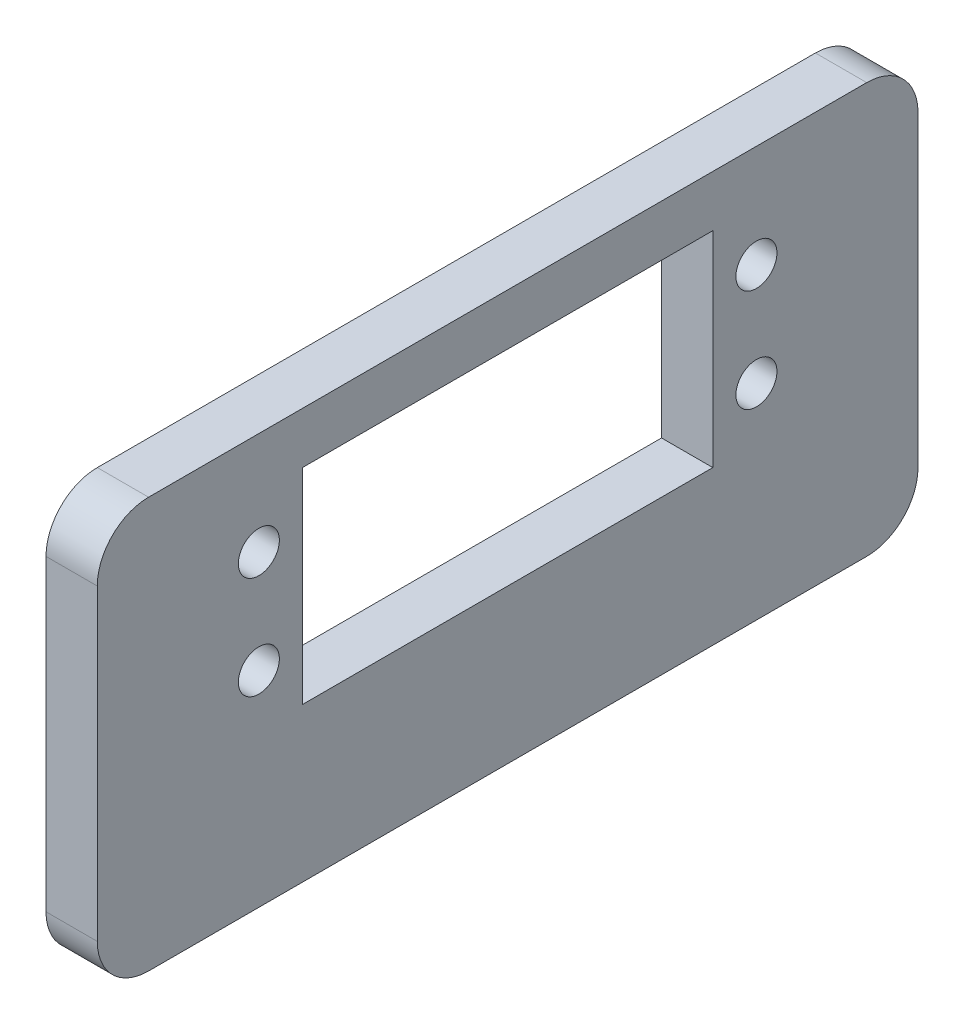
ISO-10303-21;
HEADER;
FILE_DESCRIPTION(('STEP AP214'),'2;1');
FILE_NAME('part.step','',(''),(''),'','','');
FILE_SCHEMA(('AUTOMOTIVE_DESIGN { 1 0 10303 214 1 1 1 1 }'));
ENDSEC;
DATA;
#1=APPLICATION_CONTEXT('core data for automotive mechanical design processes');
#2=APPLICATION_PROTOCOL_DEFINITION('international standard','automotive_design',2000,#1);
#3=PRODUCT_CONTEXT('',#1,'mechanical');
#4=PRODUCT('Part','Part','',(#3));
#5=PRODUCT_RELATED_PRODUCT_CATEGORY('part','',(#4));
#6=PRODUCT_DEFINITION_FORMATION('','',#4);
#7=PRODUCT_DEFINITION_CONTEXT('part definition',#1,'design');
#8=PRODUCT_DEFINITION('design','',#6,#7);
#9=PRODUCT_DEFINITION_SHAPE('','',#8);
#10=(LENGTH_UNIT() NAMED_UNIT(*) SI_UNIT(.MILLI.,.METRE.));
#11=(NAMED_UNIT(*) PLANE_ANGLE_UNIT() SI_UNIT($,.RADIAN.));
#12=(NAMED_UNIT(*) SI_UNIT($,.STERADIAN.) SOLID_ANGLE_UNIT());
#13=UNCERTAINTY_MEASURE_WITH_UNIT(LENGTH_MEASURE(1.E-05),#10,'distance_accuracy_value','');
#14=(GEOMETRIC_REPRESENTATION_CONTEXT(3) GLOBAL_UNCERTAINTY_ASSIGNED_CONTEXT((#13)) GLOBAL_UNIT_ASSIGNED_CONTEXT((#10,
#11,#12)) REPRESENTATION_CONTEXT('',''));
#15=CARTESIAN_POINT('',(0.,0.,0.));
#16=DIRECTION('',(0.,0.,1.));
#17=DIRECTION('',(1.,0.,0.));
#18=AXIS2_PLACEMENT_3D('',#15,#16,#17);
#19=CARTESIAN_POINT('',(5.,0.,0.));
#20=DIRECTION('',(1.,0.,0.));
#21=DIRECTION('',(0.,0.,-1.));
#22=AXIS2_PLACEMENT_3D('',#19,#20,#21);
#23=PLANE('',#22);
#24=CARTESIAN_POINT('',(5.,9.99999999999998,24.25));
#25=DIRECTION('',(1.,0.,0.));
#26=DIRECTION('',(0.,0.,1.));
#27=AXIS2_PLACEMENT_3D('',#24,#25,#26);
#28=CIRCLE('',#27,2.00000000000001);
#29=CARTESIAN_POINT('',(5.,9.99999999999998,26.25));
#30=VERTEX_POINT('',#29);
#31=EDGE_CURVE('E177',#30,#30,#28,.T.);
#32=ORIENTED_EDGE('',*,*,#31,.F.);
#33=EDGE_LOOP('',(#32));
#34=FACE_BOUND('',#33,.T.);
#35=CARTESIAN_POINT('',(5.,9.99999999999999,-24.25));
#36=DIRECTION('',(1.,0.,0.));
#37=DIRECTION('',(0.,0.,-1.));
#38=AXIS2_PLACEMENT_3D('',#35,#36,#37);
#39=CIRCLE('',#38,2.);
#40=CARTESIAN_POINT('',(5.,9.99999999999999,-26.25));
#41=VERTEX_POINT('',#40);
#42=EDGE_CURVE('E189',#41,#41,#39,.T.);
#43=ORIENTED_EDGE('',*,*,#42,.F.);
#44=EDGE_LOOP('',(#43));
#45=FACE_BOUND('',#44,.T.);
#46=DIRECTION('',(0.,-1.,0.));
#47=VECTOR('',#46,1.);
#48=CARTESIAN_POINT('',(5.,-20.,40.));
#49=LINE('',#48,#47);
#50=CARTESIAN_POINT('',(5.,15.,40.));
#51=VERTEX_POINT('',#50);
#52=CARTESIAN_POINT('',(5.,-15.,40.));
#53=VERTEX_POINT('',#52);
#54=EDGE_CURVE('E195',#51,#53,#49,.T.);
#55=ORIENTED_EDGE('',*,*,#54,.T.);
#56=CARTESIAN_POINT('',(5.,-15.,35.));
#57=DIRECTION('',(1.,0.,0.));
#58=DIRECTION('',(0.,0.,-1.));
#59=AXIS2_PLACEMENT_3D('',#56,#57,#58);
#60=CIRCLE('',#59,5.);
#61=CARTESIAN_POINT('',(5.,-20.,35.));
#62=VERTEX_POINT('',#61);
#63=EDGE_CURVE('E238',#53,#62,#60,.T.);
#64=ORIENTED_EDGE('',*,*,#63,.T.);
#65=DIRECTION('',(0.,0.,-1.));
#66=VECTOR('',#65,1.);
#67=CARTESIAN_POINT('',(5.,-20.,-40.));
#68=LINE('',#67,#66);
#69=CARTESIAN_POINT('',(5.,-20.,-35.));
#70=VERTEX_POINT('',#69);
#71=EDGE_CURVE('E198',#62,#70,#68,.T.);
#72=ORIENTED_EDGE('',*,*,#71,.T.);
#73=CARTESIAN_POINT('',(5.,-15.,-35.));
#74=DIRECTION('',(1.,0.,0.));
#75=DIRECTION('',(0.,0.,-1.));
#76=AXIS2_PLACEMENT_3D('',#73,#74,#75);
#77=CIRCLE('',#76,5.);
#78=CARTESIAN_POINT('',(5.,-15.,-40.));
#79=VERTEX_POINT('',#78);
#80=EDGE_CURVE('E236',#70,#79,#77,.T.);
#81=ORIENTED_EDGE('',*,*,#80,.T.);
#82=DIRECTION('',(0.,1.,0.));
#83=VECTOR('',#82,1.);
#84=CARTESIAN_POINT('',(5.,-20.,-40.));
#85=LINE('',#84,#83);
#86=CARTESIAN_POINT('',(5.,15.,-40.));
#87=VERTEX_POINT('',#86);
#88=EDGE_CURVE('E202',#79,#87,#85,.T.);
#89=ORIENTED_EDGE('',*,*,#88,.T.);
#90=CARTESIAN_POINT('',(5.,15.,-35.));
#91=DIRECTION('',(1.,0.,0.));
#92=DIRECTION('',(0.,0.,-1.));
#93=AXIS2_PLACEMENT_3D('',#90,#91,#92);
#94=CIRCLE('',#93,5.);
#95=CARTESIAN_POINT('',(5.,20.,-35.));
#96=VERTEX_POINT('',#95);
#97=EDGE_CURVE('E60',#87,#96,#94,.T.);
#98=ORIENTED_EDGE('',*,*,#97,.T.);
#99=DIRECTION('',(0.,0.,1.));
#100=VECTOR('',#99,1.);
#101=CARTESIAN_POINT('',(5.,20.,-40.));
#102=LINE('',#101,#100);
#103=CARTESIAN_POINT('',(5.,20.,35.));
#104=VERTEX_POINT('',#103);
#105=EDGE_CURVE('E204',#96,#104,#102,.T.);
#106=ORIENTED_EDGE('',*,*,#105,.T.);
#107=CARTESIAN_POINT('',(5.,15.,35.));
#108=DIRECTION('',(1.,0.,0.));
#109=DIRECTION('',(0.,0.,-1.));
#110=AXIS2_PLACEMENT_3D('',#107,#108,#109);
#111=CIRCLE('',#110,5.);
#112=EDGE_CURVE('E233',#104,#51,#111,.T.);
#113=ORIENTED_EDGE('',*,*,#112,.T.);
#114=EDGE_LOOP('',(#55,#64,#72,#81,#89,#98,#106,#113));
#115=FACE_BOUND('',#114,.T.);
#116=CARTESIAN_POINT('',(5.,0.,-24.25));
#117=DIRECTION('',(1.,0.,0.));
#118=DIRECTION('',(0.,0.,-1.));
#119=AXIS2_PLACEMENT_3D('',#116,#117,#118);
#120=CIRCLE('',#119,2.);
#121=CARTESIAN_POINT('',(5.,0.,-26.25));
#122=VERTEX_POINT('',#121);
#123=EDGE_CURVE('E183',#122,#122,#120,.T.);
#124=ORIENTED_EDGE('',*,*,#123,.F.);
#125=EDGE_LOOP('',(#124));
#126=FACE_BOUND('',#125,.T.);
#127=CARTESIAN_POINT('',(5.,0.,24.25));
#128=DIRECTION('',(1.,0.,0.));
#129=DIRECTION('',(0.,0.,1.));
#130=AXIS2_PLACEMENT_3D('',#127,#128,#129);
#131=CIRCLE('',#130,2.);
#132=CARTESIAN_POINT('',(5.,0.,26.25));
#133=VERTEX_POINT('',#132);
#134=EDGE_CURVE('E171',#133,#133,#131,.T.);
#135=ORIENTED_EDGE('',*,*,#134,.F.);
#136=EDGE_LOOP('',(#135));
#137=FACE_BOUND('',#136,.T.);
#138=DIRECTION('',(0.,0.,-1.));
#139=VECTOR('',#138,1.);
#140=CARTESIAN_POINT('',(5.,-5.00000000000002,-20.));
#141=LINE('',#140,#139);
#142=CARTESIAN_POINT('',(5.,-5.00000000000002,20.));
#143=VERTEX_POINT('',#142);
#144=CARTESIAN_POINT('',(5.,-5.00000000000002,-20.));
#145=VERTEX_POINT('',#144);
#146=EDGE_CURVE('E140',#143,#145,#141,.T.);
#147=ORIENTED_EDGE('',*,*,#146,.F.);
#148=DIRECTION('',(0.,-1.,0.));
#149=VECTOR('',#148,1.);
#150=CARTESIAN_POINT('',(5.,-5.00000000000002,20.));
#151=LINE('',#150,#149);
#152=CARTESIAN_POINT('',(5.,15.,20.));
#153=VERTEX_POINT('',#152);
#154=EDGE_CURVE('E130',#153,#143,#151,.T.);
#155=ORIENTED_EDGE('',*,*,#154,.F.);
#156=DIRECTION('',(0.,0.,1.));
#157=VECTOR('',#156,1.);
#158=CARTESIAN_POINT('',(5.,15.,-20.));
#159=LINE('',#158,#157);
#160=CARTESIAN_POINT('',(5.,15.,-20.));
#161=VERTEX_POINT('',#160);
#162=EDGE_CURVE('E155',#161,#153,#159,.T.);
#163=ORIENTED_EDGE('',*,*,#162,.F.);
#164=DIRECTION('',(0.,1.,0.));
#165=VECTOR('',#164,1.);
#166=CARTESIAN_POINT('',(5.,-5.00000000000002,-20.));
#167=LINE('',#166,#165);
#168=EDGE_CURVE('E153',#145,#161,#167,.T.);
#169=ORIENTED_EDGE('',*,*,#168,.F.);
#170=EDGE_LOOP('',(#147,#155,#163,#169));
#171=FACE_BOUND('',#170,.T.);
#172=ADVANCED_FACE('F39',(#34,#45,#115,#126,#137,#171),#23,.T.);
#173=CARTESIAN_POINT('',(0.,0.,0.));
#174=DIRECTION('',(1.,0.,0.));
#175=DIRECTION('',(0.,0.,-1.));
#176=AXIS2_PLACEMENT_3D('',#173,#174,#175);
#177=PLANE('',#176);
#178=CARTESIAN_POINT('',(0.,0.,24.25));
#179=DIRECTION('',(1.,0.,0.));
#180=DIRECTION('',(0.,0.,1.));
#181=AXIS2_PLACEMENT_3D('',#178,#179,#180);
#182=CIRCLE('',#181,2.);
#183=CARTESIAN_POINT('',(0.,0.,26.25));
#184=VERTEX_POINT('',#183);
#185=EDGE_CURVE('E148',#184,#184,#182,.T.);
#186=ORIENTED_EDGE('',*,*,#185,.T.);
#187=EDGE_LOOP('',(#186));
#188=FACE_BOUND('',#187,.T.);
#189=CARTESIAN_POINT('',(0.,9.99999999999998,24.25));
#190=DIRECTION('',(1.,0.,0.));
#191=DIRECTION('',(0.,0.,1.));
#192=AXIS2_PLACEMENT_3D('',#189,#190,#191);
#193=CIRCLE('',#192,2.00000000000001);
#194=CARTESIAN_POINT('',(0.,9.99999999999998,26.25));
#195=VERTEX_POINT('',#194);
#196=EDGE_CURVE('E174',#195,#195,#193,.T.);
#197=ORIENTED_EDGE('',*,*,#196,.T.);
#198=EDGE_LOOP('',(#197));
#199=FACE_BOUND('',#198,.T.);
#200=CARTESIAN_POINT('',(0.,0.,-24.25));
#201=DIRECTION('',(1.,0.,0.));
#202=DIRECTION('',(0.,0.,-1.));
#203=AXIS2_PLACEMENT_3D('',#200,#201,#202);
#204=CIRCLE('',#203,2.);
#205=CARTESIAN_POINT('',(0.,0.,-26.25));
#206=VERTEX_POINT('',#205);
#207=EDGE_CURVE('E180',#206,#206,#204,.T.);
#208=ORIENTED_EDGE('',*,*,#207,.T.);
#209=EDGE_LOOP('',(#208));
#210=FACE_BOUND('',#209,.T.);
#211=CARTESIAN_POINT('',(0.,9.99999999999999,-24.25));
#212=DIRECTION('',(1.,0.,0.));
#213=DIRECTION('',(0.,0.,-1.));
#214=AXIS2_PLACEMENT_3D('',#211,#212,#213);
#215=CIRCLE('',#214,2.);
#216=CARTESIAN_POINT('',(0.,9.99999999999999,-26.25));
#217=VERTEX_POINT('',#216);
#218=EDGE_CURVE('E186',#217,#217,#215,.T.);
#219=ORIENTED_EDGE('',*,*,#218,.T.);
#220=EDGE_LOOP('',(#219));
#221=FACE_BOUND('',#220,.T.);
#222=DIRECTION('',(0.,0.,-1.));
#223=VECTOR('',#222,1.);
#224=CARTESIAN_POINT('',(0.,-20.,-40.));
#225=LINE('',#224,#223);
#226=CARTESIAN_POINT('',(0.,-20.,35.));
#227=VERTEX_POINT('',#226);
#228=CARTESIAN_POINT('',(0.,-20.,-35.));
#229=VERTEX_POINT('',#228);
#230=EDGE_CURVE('E209',#227,#229,#225,.T.);
#231=ORIENTED_EDGE('',*,*,#230,.F.);
#232=CARTESIAN_POINT('',(0.,-15.,35.));
#233=DIRECTION('',(1.,0.,0.));
#234=DIRECTION('',(0.,0.,-1.));
#235=AXIS2_PLACEMENT_3D('',#232,#233,#234);
#236=CIRCLE('',#235,5.);
#237=CARTESIAN_POINT('',(0.,-15.,40.));
#238=VERTEX_POINT('',#237);
#239=EDGE_CURVE('E226',#227,#238,#236,.F.);
#240=ORIENTED_EDGE('',*,*,#239,.T.);
#241=DIRECTION('',(0.,-1.,0.));
#242=VECTOR('',#241,1.);
#243=CARTESIAN_POINT('',(0.,-20.,40.));
#244=LINE('',#243,#242);
#245=CARTESIAN_POINT('',(0.,15.,40.));
#246=VERTEX_POINT('',#245);
#247=EDGE_CURVE('E192',#246,#238,#244,.T.);
#248=ORIENTED_EDGE('',*,*,#247,.F.);
#249=CARTESIAN_POINT('',(0.,15.,35.));
#250=DIRECTION('',(1.,0.,0.));
#251=DIRECTION('',(0.,0.,-1.));
#252=AXIS2_PLACEMENT_3D('',#249,#250,#251);
#253=CIRCLE('',#252,5.);
#254=CARTESIAN_POINT('',(0.,20.,35.));
#255=VERTEX_POINT('',#254);
#256=EDGE_CURVE('E220',#246,#255,#253,.F.);
#257=ORIENTED_EDGE('',*,*,#256,.T.);
#258=DIRECTION('',(0.,0.,1.));
#259=VECTOR('',#258,1.);
#260=CARTESIAN_POINT('',(0.,20.,-40.));
#261=LINE('',#260,#259);
#262=CARTESIAN_POINT('',(0.,20.,-35.));
#263=VERTEX_POINT('',#262);
#264=EDGE_CURVE('E199',#263,#255,#261,.T.);
#265=ORIENTED_EDGE('',*,*,#264,.F.);
#266=CARTESIAN_POINT('',(0.,15.,-35.));
#267=DIRECTION('',(1.,0.,0.));
#268=DIRECTION('',(0.,0.,-1.));
#269=AXIS2_PLACEMENT_3D('',#266,#267,#268);
#270=CIRCLE('',#269,5.);
#271=CARTESIAN_POINT('',(0.,15.,-40.));
#272=VERTEX_POINT('',#271);
#273=EDGE_CURVE('E222',#263,#272,#270,.F.);
#274=ORIENTED_EDGE('',*,*,#273,.T.);
#275=DIRECTION('',(0.,1.,0.));
#276=VECTOR('',#275,1.);
#277=CARTESIAN_POINT('',(0.,-20.,-40.));
#278=LINE('',#277,#276);
#279=CARTESIAN_POINT('',(0.,-15.,-40.));
#280=VERTEX_POINT('',#279);
#281=EDGE_CURVE('E212',#280,#272,#278,.T.);
#282=ORIENTED_EDGE('',*,*,#281,.F.);
#283=CARTESIAN_POINT('',(0.,-15.,-35.));
#284=DIRECTION('',(1.,0.,0.));
#285=DIRECTION('',(0.,0.,-1.));
#286=AXIS2_PLACEMENT_3D('',#283,#284,#285);
#287=CIRCLE('',#286,5.);
#288=EDGE_CURVE('E224',#280,#229,#287,.F.);
#289=ORIENTED_EDGE('',*,*,#288,.T.);
#290=EDGE_LOOP('',(#231,#240,#248,#257,#265,#274,#282,#289));
#291=FACE_BOUND('',#290,.T.);
#292=DIRECTION('',(0.,-1.,0.));
#293=VECTOR('',#292,1.);
#294=CARTESIAN_POINT('',(0.,-5.00000000000002,20.));
#295=LINE('',#294,#293);
#296=CARTESIAN_POINT('',(0.,15.,20.));
#297=VERTEX_POINT('',#296);
#298=CARTESIAN_POINT('',(0.,-5.00000000000002,20.));
#299=VERTEX_POINT('',#298);
#300=EDGE_CURVE('E159',#297,#299,#295,.T.);
#301=ORIENTED_EDGE('',*,*,#300,.T.);
#302=DIRECTION('',(0.,0.,-1.));
#303=VECTOR('',#302,1.);
#304=CARTESIAN_POINT('',(0.,-5.00000000000002,-20.));
#305=LINE('',#304,#303);
#306=CARTESIAN_POINT('',(0.,-5.00000000000002,-20.));
#307=VERTEX_POINT('',#306);
#308=EDGE_CURVE('E147',#299,#307,#305,.T.);
#309=ORIENTED_EDGE('',*,*,#308,.T.);
#310=DIRECTION('',(0.,1.,0.));
#311=VECTOR('',#310,1.);
#312=CARTESIAN_POINT('',(0.,-5.00000000000002,-20.));
#313=LINE('',#312,#311);
#314=CARTESIAN_POINT('',(0.,15.,-20.));
#315=VERTEX_POINT('',#314);
#316=EDGE_CURVE('E162',#307,#315,#313,.T.);
#317=ORIENTED_EDGE('',*,*,#316,.T.);
#318=DIRECTION('',(0.,0.,1.));
#319=VECTOR('',#318,1.);
#320=CARTESIAN_POINT('',(0.,15.,-20.));
#321=LINE('',#320,#319);
#322=EDGE_CURVE('E141',#315,#297,#321,.T.);
#323=ORIENTED_EDGE('',*,*,#322,.T.);
#324=EDGE_LOOP('',(#301,#309,#317,#323));
#325=FACE_BOUND('',#324,.T.);
#326=ADVANCED_FACE('F254',(#188,#199,#210,#221,#291,#325),#177,.F.);
#327=CARTESIAN_POINT('',(5.,-20.,40.));
#328=DIRECTION('',(0.,0.,-1.));
#329=DIRECTION('',(0.,1.,0.));
#330=AXIS2_PLACEMENT_3D('',#327,#328,#329);
#331=PLANE('',#330);
#332=ORIENTED_EDGE('',*,*,#247,.T.);
#333=DIRECTION('',(-1.,0.,0.));
#334=VECTOR('',#333,1.);
#335=CARTESIAN_POINT('',(5.,-15.,40.));
#336=LINE('',#335,#334);
#337=EDGE_CURVE('E231',#238,#53,#336,.F.);
#338=ORIENTED_EDGE('',*,*,#337,.T.);
#339=ORIENTED_EDGE('',*,*,#54,.F.);
#340=DIRECTION('',(-1.,0.,0.));
#341=VECTOR('',#340,1.);
#342=CARTESIAN_POINT('',(5.,15.,40.));
#343=LINE('',#342,#341);
#344=EDGE_CURVE('E228',#51,#246,#343,.T.);
#345=ORIENTED_EDGE('',*,*,#344,.T.);
#346=EDGE_LOOP('',(#332,#338,#339,#345));
#347=FACE_BOUND('',#346,.T.);
#348=ADVANCED_FACE('F268',(#347),#331,.F.);
#349=CARTESIAN_POINT('',(5.,-20.,-40.));
#350=DIRECTION('',(0.,1.,0.));
#351=DIRECTION('',(0.,0.,1.));
#352=AXIS2_PLACEMENT_3D('',#349,#350,#351);
#353=PLANE('',#352);
#354=ORIENTED_EDGE('',*,*,#71,.F.);
#355=DIRECTION('',(-1.,0.,0.));
#356=VECTOR('',#355,1.);
#357=CARTESIAN_POINT('',(5.,-20.,35.));
#358=LINE('',#357,#356);
#359=EDGE_CURVE('E217',#62,#227,#358,.T.);
#360=ORIENTED_EDGE('',*,*,#359,.T.);
#361=ORIENTED_EDGE('',*,*,#230,.T.);
#362=DIRECTION('',(-1.,0.,0.));
#363=VECTOR('',#362,1.);
#364=CARTESIAN_POINT('',(5.,-20.,-35.));
#365=LINE('',#364,#363);
#366=EDGE_CURVE('E206',#229,#70,#365,.F.);
#367=ORIENTED_EDGE('',*,*,#366,.T.);
#368=EDGE_LOOP('',(#354,#360,#361,#367));
#369=FACE_BOUND('',#368,.T.);
#370=ADVANCED_FACE('F276',(#369),#353,.F.);
#371=CARTESIAN_POINT('',(5.,-20.,-40.));
#372=DIRECTION('',(0.,0.,1.));
#373=DIRECTION('',(0.,-1.,0.));
#374=AXIS2_PLACEMENT_3D('',#371,#372,#373);
#375=PLANE('',#374);
#376=ORIENTED_EDGE('',*,*,#88,.F.);
#377=DIRECTION('',(-1.,0.,0.));
#378=VECTOR('',#377,1.);
#379=CARTESIAN_POINT('',(5.,-15.,-40.));
#380=LINE('',#379,#378);
#381=EDGE_CURVE('E242',#79,#280,#380,.T.);
#382=ORIENTED_EDGE('',*,*,#381,.T.);
#383=ORIENTED_EDGE('',*,*,#281,.T.);
#384=DIRECTION('',(-1.,0.,0.));
#385=VECTOR('',#384,1.);
#386=CARTESIAN_POINT('',(5.,15.,-40.));
#387=LINE('',#386,#385);
#388=EDGE_CURVE('E240',#272,#87,#387,.F.);
#389=ORIENTED_EDGE('',*,*,#388,.T.);
#390=EDGE_LOOP('',(#376,#382,#383,#389));
#391=FACE_BOUND('',#390,.T.);
#392=ADVANCED_FACE('F248',(#391),#375,.F.);
#393=CARTESIAN_POINT('',(5.,20.,-40.));
#394=DIRECTION('',(0.,-1.,0.));
#395=DIRECTION('',(0.,0.,-1.));
#396=AXIS2_PLACEMENT_3D('',#393,#394,#395);
#397=PLANE('',#396);
#398=ORIENTED_EDGE('',*,*,#105,.F.);
#399=DIRECTION('',(-1.,0.,0.));
#400=VECTOR('',#399,1.);
#401=CARTESIAN_POINT('',(5.,20.,-35.));
#402=LINE('',#401,#400);
#403=EDGE_CURVE('E11',#96,#263,#402,.T.);
#404=ORIENTED_EDGE('',*,*,#403,.T.);
#405=ORIENTED_EDGE('',*,*,#264,.T.);
#406=DIRECTION('',(-1.,0.,0.));
#407=VECTOR('',#406,1.);
#408=CARTESIAN_POINT('',(5.,20.,35.));
#409=LINE('',#408,#407);
#410=EDGE_CURVE('E47',#255,#104,#409,.F.);
#411=ORIENTED_EDGE('',*,*,#410,.T.);
#412=EDGE_LOOP('',(#398,#404,#405,#411));
#413=FACE_BOUND('',#412,.T.);
#414=ADVANCED_FACE('F260',(#413),#397,.F.);
#415=CARTESIAN_POINT('',(5.,9.99999999999999,-24.25));
#416=DIRECTION('',(-1.,0.,0.));
#417=DIRECTION('',(0.,0.,1.));
#418=AXIS2_PLACEMENT_3D('',#415,#416,#417);
#419=CYLINDRICAL_SURFACE('',#418,2.);
#420=ORIENTED_EDGE('',*,*,#42,.T.);
#421=EDGE_LOOP('',(#420));
#422=FACE_BOUND('',#421,.T.);
#423=ORIENTED_EDGE('',*,*,#218,.F.);
#424=EDGE_LOOP('',(#423));
#425=FACE_BOUND('',#424,.T.);
#426=ADVANCED_FACE('F299',(#422,#425),#419,.F.);
#427=CARTESIAN_POINT('',(5.,0.,-24.25));
#428=DIRECTION('',(-1.,0.,0.));
#429=DIRECTION('',(0.,0.,1.));
#430=AXIS2_PLACEMENT_3D('',#427,#428,#429);
#431=CYLINDRICAL_SURFACE('',#430,2.);
#432=ORIENTED_EDGE('',*,*,#123,.T.);
#433=EDGE_LOOP('',(#432));
#434=FACE_BOUND('',#433,.T.);
#435=ORIENTED_EDGE('',*,*,#207,.F.);
#436=EDGE_LOOP('',(#435));
#437=FACE_BOUND('',#436,.T.);
#438=ADVANCED_FACE('F406',(#434,#437),#431,.F.);
#439=CARTESIAN_POINT('',(5.,9.99999999999998,24.25));
#440=DIRECTION('',(-1.,0.,0.));
#441=DIRECTION('',(0.,0.,1.));
#442=AXIS2_PLACEMENT_3D('',#439,#440,#441);
#443=CYLINDRICAL_SURFACE('',#442,2.00000000000001);
#444=ORIENTED_EDGE('',*,*,#31,.T.);
#445=EDGE_LOOP('',(#444));
#446=FACE_BOUND('',#445,.T.);
#447=ORIENTED_EDGE('',*,*,#196,.F.);
#448=EDGE_LOOP('',(#447));
#449=FACE_BOUND('',#448,.T.);
#450=ADVANCED_FACE('F396',(#446,#449),#443,.F.);
#451=CARTESIAN_POINT('',(5.,0.,24.25));
#452=DIRECTION('',(-1.,0.,0.));
#453=DIRECTION('',(0.,0.,1.));
#454=AXIS2_PLACEMENT_3D('',#451,#452,#453);
#455=CYLINDRICAL_SURFACE('',#454,2.);
#456=ORIENTED_EDGE('',*,*,#134,.T.);
#457=EDGE_LOOP('',(#456));
#458=FACE_BOUND('',#457,.T.);
#459=ORIENTED_EDGE('',*,*,#185,.F.);
#460=EDGE_LOOP('',(#459));
#461=FACE_BOUND('',#460,.T.);
#462=ADVANCED_FACE('F387',(#458,#461),#455,.F.);
#463=CARTESIAN_POINT('',(5.,-5.00000000000002,20.));
#464=DIRECTION('',(0.,0.,-1.));
#465=DIRECTION('',(-1.,0.,0.));
#466=AXIS2_PLACEMENT_3D('',#463,#464,#465);
#467=PLANE('',#466);
#468=ORIENTED_EDGE('',*,*,#300,.F.);
#469=DIRECTION('',(-1.,0.,0.));
#470=VECTOR('',#469,1.);
#471=CARTESIAN_POINT('',(5.,15.,20.));
#472=LINE('',#471,#470);
#473=EDGE_CURVE('E136',#153,#297,#472,.T.);
#474=ORIENTED_EDGE('',*,*,#473,.F.);
#475=ORIENTED_EDGE('',*,*,#154,.T.);
#476=DIRECTION('',(-1.,0.,0.));
#477=VECTOR('',#476,1.);
#478=CARTESIAN_POINT('',(5.,-5.00000000000002,20.));
#479=LINE('',#478,#477);
#480=EDGE_CURVE('E133',#143,#299,#479,.T.);
#481=ORIENTED_EDGE('',*,*,#480,.T.);
#482=EDGE_LOOP('',(#468,#474,#475,#481));
#483=FACE_BOUND('',#482,.T.);
#484=ADVANCED_FACE('F132',(#483),#467,.T.);
#485=CARTESIAN_POINT('',(5.,-5.00000000000002,-20.));
#486=DIRECTION('',(0.,1.,0.));
#487=DIRECTION('',(0.,0.,1.));
#488=AXIS2_PLACEMENT_3D('',#485,#486,#487);
#489=PLANE('',#488);
#490=ORIENTED_EDGE('',*,*,#308,.F.);
#491=ORIENTED_EDGE('',*,*,#480,.F.);
#492=ORIENTED_EDGE('',*,*,#146,.T.);
#493=DIRECTION('',(-1.,0.,0.));
#494=VECTOR('',#493,1.);
#495=CARTESIAN_POINT('',(5.,-5.00000000000002,-20.));
#496=LINE('',#495,#494);
#497=EDGE_CURVE('E149',#145,#307,#496,.T.);
#498=ORIENTED_EDGE('',*,*,#497,.T.);
#499=EDGE_LOOP('',(#490,#491,#492,#498));
#500=FACE_BOUND('',#499,.T.);
#501=ADVANCED_FACE('F144',(#500),#489,.T.);
#502=CARTESIAN_POINT('',(5.,-5.00000000000002,-20.));
#503=DIRECTION('',(0.,0.,1.));
#504=DIRECTION('',(1.,0.,0.));
#505=AXIS2_PLACEMENT_3D('',#502,#503,#504);
#506=PLANE('',#505);
#507=ORIENTED_EDGE('',*,*,#316,.F.);
#508=ORIENTED_EDGE('',*,*,#497,.F.);
#509=ORIENTED_EDGE('',*,*,#168,.T.);
#510=DIRECTION('',(-1.,0.,0.));
#511=VECTOR('',#510,1.);
#512=CARTESIAN_POINT('',(5.,15.,-20.));
#513=LINE('',#512,#511);
#514=EDGE_CURVE('E168',#161,#315,#513,.T.);
#515=ORIENTED_EDGE('',*,*,#514,.T.);
#516=EDGE_LOOP('',(#507,#508,#509,#515));
#517=FACE_BOUND('',#516,.T.);
#518=ADVANCED_FACE('F360',(#517),#506,.T.);
#519=CARTESIAN_POINT('',(5.,15.,-20.));
#520=DIRECTION('',(0.,-1.,0.));
#521=DIRECTION('',(0.,0.,-1.));
#522=AXIS2_PLACEMENT_3D('',#519,#520,#521);
#523=PLANE('',#522);
#524=ORIENTED_EDGE('',*,*,#322,.F.);
#525=ORIENTED_EDGE('',*,*,#514,.F.);
#526=ORIENTED_EDGE('',*,*,#162,.T.);
#527=ORIENTED_EDGE('',*,*,#473,.T.);
#528=EDGE_LOOP('',(#524,#525,#526,#527));
#529=FACE_BOUND('',#528,.T.);
#530=ADVANCED_FACE('F285',(#529),#523,.T.);
#531=CARTESIAN_POINT('',(5.,-15.,35.));
#532=DIRECTION('',(-1.,0.,0.));
#533=DIRECTION('',(0.,0.,1.));
#534=AXIS2_PLACEMENT_3D('',#531,#532,#533);
#535=CYLINDRICAL_SURFACE('',#534,5.);
#536=ORIENTED_EDGE('',*,*,#63,.F.);
#537=ORIENTED_EDGE('',*,*,#337,.F.);
#538=ORIENTED_EDGE('',*,*,#239,.F.);
#539=ORIENTED_EDGE('',*,*,#359,.F.);
#540=EDGE_LOOP('',(#536,#537,#538,#539));
#541=FACE_BOUND('',#540,.T.);
#542=ADVANCED_FACE('F273',(#541),#535,.T.);
#543=CARTESIAN_POINT('',(5.,-15.,-35.));
#544=DIRECTION('',(-1.,0.,0.));
#545=DIRECTION('',(0.,0.,1.));
#546=AXIS2_PLACEMENT_3D('',#543,#544,#545);
#547=CYLINDRICAL_SURFACE('',#546,5.);
#548=ORIENTED_EDGE('',*,*,#80,.F.);
#549=ORIENTED_EDGE('',*,*,#366,.F.);
#550=ORIENTED_EDGE('',*,*,#288,.F.);
#551=ORIENTED_EDGE('',*,*,#381,.F.);
#552=EDGE_LOOP('',(#548,#549,#550,#551));
#553=FACE_BOUND('',#552,.T.);
#554=ADVANCED_FACE('F278',(#553),#547,.T.);
#555=CARTESIAN_POINT('',(5.,15.,-35.));
#556=DIRECTION('',(-1.,0.,0.));
#557=DIRECTION('',(0.,0.,1.));
#558=AXIS2_PLACEMENT_3D('',#555,#556,#557);
#559=CYLINDRICAL_SURFACE('',#558,5.);
#560=ORIENTED_EDGE('',*,*,#97,.F.);
#561=ORIENTED_EDGE('',*,*,#388,.F.);
#562=ORIENTED_EDGE('',*,*,#273,.F.);
#563=ORIENTED_EDGE('',*,*,#403,.F.);
#564=EDGE_LOOP('',(#560,#561,#562,#563));
#565=FACE_BOUND('',#564,.T.);
#566=ADVANCED_FACE('F259',(#565),#559,.T.);
#567=CARTESIAN_POINT('',(5.,15.,35.));
#568=DIRECTION('',(-1.,0.,0.));
#569=DIRECTION('',(0.,0.,1.));
#570=AXIS2_PLACEMENT_3D('',#567,#568,#569);
#571=CYLINDRICAL_SURFACE('',#570,5.);
#572=ORIENTED_EDGE('',*,*,#112,.F.);
#573=ORIENTED_EDGE('',*,*,#410,.F.);
#574=ORIENTED_EDGE('',*,*,#256,.F.);
#575=ORIENTED_EDGE('',*,*,#344,.F.);
#576=EDGE_LOOP('',(#572,#573,#574,#575));
#577=FACE_BOUND('',#576,.T.);
#578=ADVANCED_FACE('F41',(#577),#571,.T.);
#579=CLOSED_SHELL('',(#172,#326,#348,#370,#392,#414,#426,#438,#450,#462,#484,#501,#518,#530,
#542,#554,#566,#578));
#580=MANIFOLD_SOLID_BREP('B2',#579);
#581=ADVANCED_BREP_SHAPE_REPRESENTATION('',(#18,#580),#14);
#582=SHAPE_DEFINITION_REPRESENTATION(#9,#581);
ENDSEC;
END-ISO-10303-21;
